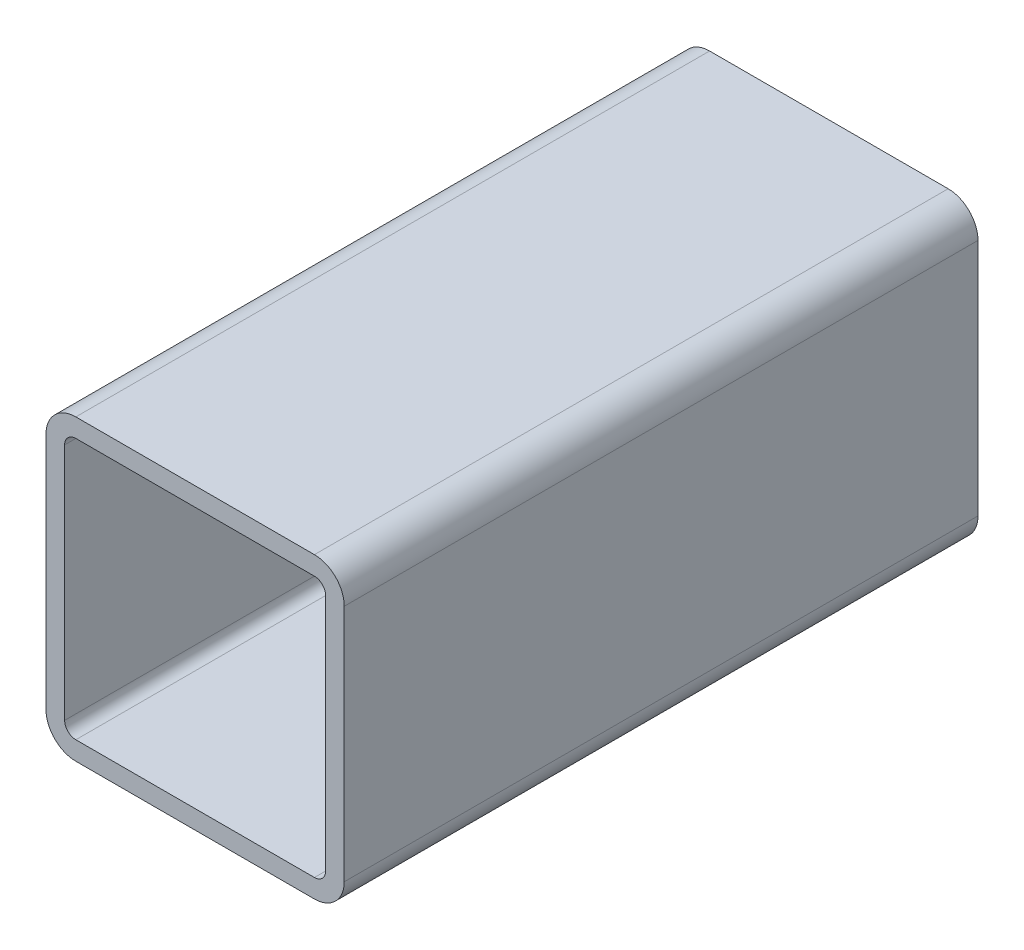
ISO-10303-21;
HEADER;
FILE_DESCRIPTION(('STEP AP214'),'2;1');
FILE_NAME('part.step','',(''),(''),'','','');
FILE_SCHEMA(('AUTOMOTIVE_DESIGN { 1 0 10303 214 1 1 1 1 }'));
ENDSEC;
DATA;
#1=APPLICATION_CONTEXT('core data for automotive mechanical design processes');
#2=APPLICATION_PROTOCOL_DEFINITION('international standard','automotive_design',2000,#1);
#3=PRODUCT_CONTEXT('',#1,'mechanical');
#4=PRODUCT('Part','Part','',(#3));
#5=PRODUCT_RELATED_PRODUCT_CATEGORY('part','',(#4));
#6=PRODUCT_DEFINITION_FORMATION('','',#4);
#7=PRODUCT_DEFINITION_CONTEXT('part definition',#1,'design');
#8=PRODUCT_DEFINITION('design','',#6,#7);
#9=PRODUCT_DEFINITION_SHAPE('','',#8);
#10=(LENGTH_UNIT() NAMED_UNIT(*) SI_UNIT(.MILLI.,.METRE.));
#11=(NAMED_UNIT(*) PLANE_ANGLE_UNIT() SI_UNIT($,.RADIAN.));
#12=(NAMED_UNIT(*) SI_UNIT($,.STERADIAN.) SOLID_ANGLE_UNIT());
#13=UNCERTAINTY_MEASURE_WITH_UNIT(LENGTH_MEASURE(1.E-05),#10,'distance_accuracy_value','');
#14=(GEOMETRIC_REPRESENTATION_CONTEXT(3) GLOBAL_UNCERTAINTY_ASSIGNED_CONTEXT((#13)) GLOBAL_UNIT_ASSIGNED_CONTEXT((#10,
#11,#12)) REPRESENTATION_CONTEXT('',''));
#15=CARTESIAN_POINT('',(0.,0.,0.));
#16=DIRECTION('',(0.,0.,1.));
#17=DIRECTION('',(1.,0.,0.));
#18=AXIS2_PLACEMENT_3D('',#15,#16,#17);
#19=CARTESIAN_POINT('',(-560.,7.99999999999944,283.137084989848));
#20=DIRECTION('',(1.,0.,0.));
#21=DIRECTION('',(0.,0.,-1.));
#22=AXIS2_PLACEMENT_3D('',#19,#20,#21);
#23=PLANE('',#22);
#24=DIRECTION('',(0.,-1.,0.));
#25=VECTOR('',#24,1.);
#26=CARTESIAN_POINT('',(-560.,7.99999999999947,170.));
#27=LINE('',#26,#25);
#28=CARTESIAN_POINT('',(-560.,71.9999999999995,170.));
#29=VERTEX_POINT('',#28);
#30=CARTESIAN_POINT('',(-560.,7.99999999999944,170.));
#31=VERTEX_POINT('',#30);
#32=EDGE_CURVE('E304',#29,#31,#27,.T.);
#33=ORIENTED_EDGE('',*,*,#32,.F.);
#34=DIRECTION('',(0.,0.,-1.));
#35=VECTOR('',#34,1.);
#36=CARTESIAN_POINT('',(-560.,71.9999999999995,283.137084989848));
#37=LINE('',#36,#35);
#38=CARTESIAN_POINT('',(-560.,71.9999999999995,0.));
#39=VERTEX_POINT('',#38);
#40=EDGE_CURVE('E48',#29,#39,#37,.T.);
#41=ORIENTED_EDGE('',*,*,#40,.T.);
#42=DIRECTION('',(0.,-1.,0.));
#43=VECTOR('',#42,1.);
#44=CARTESIAN_POINT('',(-560.,7.99999999999944,0.));
#45=LINE('',#44,#43);
#46=CARTESIAN_POINT('',(-560.,7.99999999999944,0.));
#47=VERTEX_POINT('',#46);
#48=EDGE_CURVE('E199',#39,#47,#45,.T.);
#49=ORIENTED_EDGE('',*,*,#48,.T.);
#50=DIRECTION('',(0.,0.,-1.));
#51=VECTOR('',#50,1.);
#52=CARTESIAN_POINT('',(-560.,7.99999999999944,283.137084989848));
#53=LINE('',#52,#51);
#54=EDGE_CURVE('E202',#31,#47,#53,.T.);
#55=ORIENTED_EDGE('',*,*,#54,.F.);
#56=EDGE_LOOP('',(#33,#41,#49,#55));
#57=FACE_BOUND('',#56,.T.);
#58=ADVANCED_FACE('F33',(#57),#23,.F.);
#59=CARTESIAN_POINT('',(-552.,71.9999999999995,283.137084989848));
#60=DIRECTION('',(0.,0.,-1.));
#61=DIRECTION('',(-1.,0.,0.));
#62=AXIS2_PLACEMENT_3D('',#59,#60,#61);
#63=CYLINDRICAL_SURFACE('',#62,8.);
#64=CARTESIAN_POINT('',(-552.,71.9999999999995,170.));
#65=DIRECTION('',(0.,0.,1.));
#66=DIRECTION('',(0.,-1.,0.));
#67=AXIS2_PLACEMENT_3D('',#64,#65,#66);
#68=CIRCLE('',#67,8.);
#69=CARTESIAN_POINT('',(-552.,79.9999999999995,170.));
#70=VERTEX_POINT('',#69);
#71=EDGE_CURVE('E240',#70,#29,#68,.T.);
#72=ORIENTED_EDGE('',*,*,#71,.F.);
#73=DIRECTION('',(0.,0.,-1.));
#74=VECTOR('',#73,1.);
#75=CARTESIAN_POINT('',(-552.,79.9999999999995,283.137084989848));
#76=LINE('',#75,#74);
#77=CARTESIAN_POINT('',(-552.,79.9999999999995,0.));
#78=VERTEX_POINT('',#77);
#79=EDGE_CURVE('E205',#70,#78,#76,.T.);
#80=ORIENTED_EDGE('',*,*,#79,.T.);
#81=CARTESIAN_POINT('',(-552.,71.9999999999995,0.));
#82=DIRECTION('',(0.,0.,1.));
#83=DIRECTION('',(-1.,0.,0.));
#84=AXIS2_PLACEMENT_3D('',#81,#82,#83);
#85=CIRCLE('',#84,8.);
#86=EDGE_CURVE('E197',#78,#39,#85,.T.);
#87=ORIENTED_EDGE('',*,*,#86,.T.);
#88=ORIENTED_EDGE('',*,*,#40,.F.);
#89=EDGE_LOOP('',(#72,#80,#87,#88));
#90=FACE_BOUND('',#89,.T.);
#91=ADVANCED_FACE('F237',(#90),#63,.T.);
#92=CARTESIAN_POINT('',(-488.,79.9999999999995,283.137084989848));
#93=DIRECTION('',(0.,-1.,0.));
#94=DIRECTION('',(0.,0.,-1.));
#95=AXIS2_PLACEMENT_3D('',#92,#93,#94);
#96=PLANE('',#95);
#97=DIRECTION('',(-1.,0.,0.));
#98=VECTOR('',#97,1.);
#99=CARTESIAN_POINT('',(-488.,79.9999999999995,170.));
#100=LINE('',#99,#98);
#101=CARTESIAN_POINT('',(-488.,79.9999999999995,170.));
#102=VERTEX_POINT('',#101);
#103=EDGE_CURVE('E245',#102,#70,#100,.T.);
#104=ORIENTED_EDGE('',*,*,#103,.F.);
#105=DIRECTION('',(0.,0.,-1.));
#106=VECTOR('',#105,1.);
#107=CARTESIAN_POINT('',(-488.,79.9999999999995,283.137084989848));
#108=LINE('',#107,#106);
#109=CARTESIAN_POINT('',(-488.,79.9999999999995,0.));
#110=VERTEX_POINT('',#109);
#111=EDGE_CURVE('E207',#102,#110,#108,.T.);
#112=ORIENTED_EDGE('',*,*,#111,.T.);
#113=DIRECTION('',(-1.,0.,0.));
#114=VECTOR('',#113,1.);
#115=CARTESIAN_POINT('',(-488.,79.9999999999995,0.));
#116=LINE('',#115,#114);
#117=EDGE_CURVE('E194',#110,#78,#116,.T.);
#118=ORIENTED_EDGE('',*,*,#117,.T.);
#119=ORIENTED_EDGE('',*,*,#79,.F.);
#120=EDGE_LOOP('',(#104,#112,#118,#119));
#121=FACE_BOUND('',#120,.T.);
#122=ADVANCED_FACE('F243',(#121),#96,.F.);
#123=CARTESIAN_POINT('',(-488.,71.9999999999995,283.137084989848));
#124=DIRECTION('',(0.,0.,-1.));
#125=DIRECTION('',(-1.,0.,0.));
#126=AXIS2_PLACEMENT_3D('',#123,#124,#125);
#127=CYLINDRICAL_SURFACE('',#126,7.99999999999999);
#128=CARTESIAN_POINT('',(-488.,71.9999999999995,170.));
#129=DIRECTION('',(0.,0.,1.));
#130=DIRECTION('',(0.,-1.,0.));
#131=AXIS2_PLACEMENT_3D('',#128,#129,#130);
#132=CIRCLE('',#131,7.99999999999999);
#133=CARTESIAN_POINT('',(-480.,71.9999999999995,170.));
#134=VERTEX_POINT('',#133);
#135=EDGE_CURVE('E308',#134,#102,#132,.T.);
#136=ORIENTED_EDGE('',*,*,#135,.F.);
#137=DIRECTION('',(0.,0.,-1.));
#138=VECTOR('',#137,1.);
#139=CARTESIAN_POINT('',(-480.,71.9999999999995,283.137084989848));
#140=LINE('',#139,#138);
#141=CARTESIAN_POINT('',(-480.,71.9999999999995,0.));
#142=VERTEX_POINT('',#141);
#143=EDGE_CURVE('E209',#134,#142,#140,.T.);
#144=ORIENTED_EDGE('',*,*,#143,.T.);
#145=CARTESIAN_POINT('',(-488.,71.9999999999995,0.));
#146=DIRECTION('',(0.,0.,1.));
#147=DIRECTION('',(-1.,0.,0.));
#148=AXIS2_PLACEMENT_3D('',#145,#146,#147);
#149=CIRCLE('',#148,7.99999999999999);
#150=EDGE_CURVE('E191',#142,#110,#149,.T.);
#151=ORIENTED_EDGE('',*,*,#150,.T.);
#152=ORIENTED_EDGE('',*,*,#111,.F.);
#153=EDGE_LOOP('',(#136,#144,#151,#152));
#154=FACE_BOUND('',#153,.T.);
#155=ADVANCED_FACE('F248',(#154),#127,.T.);
#156=CARTESIAN_POINT('',(-480.,7.99999999999946,283.137084989848));
#157=DIRECTION('',(-1.,0.,0.));
#158=DIRECTION('',(0.,0.,1.));
#159=AXIS2_PLACEMENT_3D('',#156,#157,#158);
#160=PLANE('',#159);
#161=DIRECTION('',(0.,1.,0.));
#162=VECTOR('',#161,1.);
#163=CARTESIAN_POINT('',(-480.,7.99999999999949,170.));
#164=LINE('',#163,#162);
#165=CARTESIAN_POINT('',(-480.,7.99999999999946,170.));
#166=VERTEX_POINT('',#165);
#167=EDGE_CURVE('E254',#166,#134,#164,.T.);
#168=ORIENTED_EDGE('',*,*,#167,.F.);
#169=DIRECTION('',(0.,0.,-1.));
#170=VECTOR('',#169,1.);
#171=CARTESIAN_POINT('',(-480.,7.99999999999946,283.137084989848));
#172=LINE('',#171,#170);
#173=CARTESIAN_POINT('',(-480.,7.99999999999946,0.));
#174=VERTEX_POINT('',#173);
#175=EDGE_CURVE('E211',#166,#174,#172,.T.);
#176=ORIENTED_EDGE('',*,*,#175,.T.);
#177=DIRECTION('',(0.,1.,0.));
#178=VECTOR('',#177,1.);
#179=CARTESIAN_POINT('',(-480.,7.99999999999946,0.));
#180=LINE('',#179,#178);
#181=EDGE_CURVE('E188',#174,#142,#180,.T.);
#182=ORIENTED_EDGE('',*,*,#181,.T.);
#183=ORIENTED_EDGE('',*,*,#143,.F.);
#184=EDGE_LOOP('',(#168,#176,#182,#183));
#185=FACE_BOUND('',#184,.T.);
#186=ADVANCED_FACE('F251',(#185),#160,.F.);
#187=CARTESIAN_POINT('',(-488.,7.99999999999946,283.137084989848));
#188=DIRECTION('',(0.,0.,-1.));
#189=DIRECTION('',(-1.,0.,0.));
#190=AXIS2_PLACEMENT_3D('',#187,#188,#189);
#191=CYLINDRICAL_SURFACE('',#190,8.00000000000001);
#192=CARTESIAN_POINT('',(-488.,7.99999999999946,170.));
#193=DIRECTION('',(0.,0.,1.));
#194=DIRECTION('',(0.,-1.,0.));
#195=AXIS2_PLACEMENT_3D('',#192,#193,#194);
#196=CIRCLE('',#195,8.00000000000001);
#197=CARTESIAN_POINT('',(-488.,-5.48172618408671E-13,170.));
#198=VERTEX_POINT('',#197);
#199=EDGE_CURVE('E258',#198,#166,#196,.T.);
#200=ORIENTED_EDGE('',*,*,#199,.F.);
#201=DIRECTION('',(0.,0.,-1.));
#202=VECTOR('',#201,1.);
#203=CARTESIAN_POINT('',(-488.,-5.48172618408671E-13,283.137084989848));
#204=LINE('',#203,#202);
#205=CARTESIAN_POINT('',(-488.,-5.48172618408671E-13,0.));
#206=VERTEX_POINT('',#205);
#207=EDGE_CURVE('E213',#198,#206,#204,.T.);
#208=ORIENTED_EDGE('',*,*,#207,.T.);
#209=CARTESIAN_POINT('',(-488.,7.99999999999946,0.));
#210=DIRECTION('',(0.,0.,1.));
#211=DIRECTION('',(-1.,0.,0.));
#212=AXIS2_PLACEMENT_3D('',#209,#210,#211);
#213=CIRCLE('',#212,8.00000000000001);
#214=EDGE_CURVE('E185',#206,#174,#213,.T.);
#215=ORIENTED_EDGE('',*,*,#214,.T.);
#216=ORIENTED_EDGE('',*,*,#175,.F.);
#217=EDGE_LOOP('',(#200,#208,#215,#216));
#218=FACE_BOUND('',#217,.T.);
#219=ADVANCED_FACE('F257',(#218),#191,.T.);
#220=CARTESIAN_POINT('',(-488.,-5.49907341884648E-13,283.137084989848));
#221=DIRECTION('',(0.,1.,0.));
#222=DIRECTION('',(-1.,0.,0.));
#223=AXIS2_PLACEMENT_3D('',#220,#221,#222);
#224=PLANE('',#223);
#225=DIRECTION('',(1.,0.,0.));
#226=VECTOR('',#225,1.);
#227=CARTESIAN_POINT('',(-488.,-5.49907341884648E-13,170.));
#228=LINE('',#227,#226);
#229=CARTESIAN_POINT('',(-552.,-5.58580959264532E-13,170.));
#230=VERTEX_POINT('',#229);
#231=EDGE_CURVE('E221',#230,#198,#228,.T.);
#232=ORIENTED_EDGE('',*,*,#231,.F.);
#233=DIRECTION('',(0.,0.,-1.));
#234=VECTOR('',#233,1.);
#235=CARTESIAN_POINT('',(-552.,-5.58580959264532E-13,283.137084989848));
#236=LINE('',#235,#234);
#237=CARTESIAN_POINT('',(-552.,-5.58580959264532E-13,0.));
#238=VERTEX_POINT('',#237);
#239=EDGE_CURVE('E41',#230,#238,#236,.T.);
#240=ORIENTED_EDGE('',*,*,#239,.T.);
#241=DIRECTION('',(1.,0.,0.));
#242=VECTOR('',#241,1.);
#243=CARTESIAN_POINT('',(-488.,-5.49907341884648E-13,0.));
#244=LINE('',#243,#242);
#245=EDGE_CURVE('E182',#238,#206,#244,.T.);
#246=ORIENTED_EDGE('',*,*,#245,.T.);
#247=ORIENTED_EDGE('',*,*,#207,.F.);
#248=EDGE_LOOP('',(#232,#240,#246,#247));
#249=FACE_BOUND('',#248,.T.);
#250=ADVANCED_FACE('F217',(#249),#224,.F.);
#251=CARTESIAN_POINT('',(-552.,7.99999999999944,283.137084989848));
#252=DIRECTION('',(0.,0.,-1.));
#253=DIRECTION('',(-1.,0.,0.));
#254=AXIS2_PLACEMENT_3D('',#251,#252,#253);
#255=CYLINDRICAL_SURFACE('',#254,8.);
#256=CARTESIAN_POINT('',(-552.,7.99999999999944,170.));
#257=DIRECTION('',(0.,0.,1.));
#258=DIRECTION('',(0.,-1.,0.));
#259=AXIS2_PLACEMENT_3D('',#256,#257,#258);
#260=CIRCLE('',#259,8.);
#261=EDGE_CURVE('E231',#31,#230,#260,.T.);
#262=ORIENTED_EDGE('',*,*,#261,.F.);
#263=ORIENTED_EDGE('',*,*,#54,.T.);
#264=CARTESIAN_POINT('',(-552.,7.99999999999944,0.));
#265=DIRECTION('',(0.,0.,1.));
#266=DIRECTION('',(1.,0.,0.));
#267=AXIS2_PLACEMENT_3D('',#264,#265,#266);
#268=CIRCLE('',#267,8.);
#269=EDGE_CURVE('E179',#47,#238,#268,.T.);
#270=ORIENTED_EDGE('',*,*,#269,.T.);
#271=ORIENTED_EDGE('',*,*,#239,.F.);
#272=EDGE_LOOP('',(#262,#263,#270,#271));
#273=FACE_BOUND('',#272,.T.);
#274=ADVANCED_FACE('F35',(#273),#255,.T.);
#275=CARTESIAN_POINT('',(-552.,7.99999999999944,0.));
#276=DIRECTION('',(0.,0.,1.));
#277=DIRECTION('',(1.,0.,0.));
#278=AXIS2_PLACEMENT_3D('',#275,#276,#277);
#279=PLANE('',#278);
#280=ORIENTED_EDGE('',*,*,#269,.F.);
#281=ORIENTED_EDGE('',*,*,#48,.F.);
#282=ORIENTED_EDGE('',*,*,#86,.F.);
#283=ORIENTED_EDGE('',*,*,#117,.F.);
#284=ORIENTED_EDGE('',*,*,#150,.F.);
#285=ORIENTED_EDGE('',*,*,#181,.F.);
#286=ORIENTED_EDGE('',*,*,#214,.F.);
#287=ORIENTED_EDGE('',*,*,#245,.F.);
#288=EDGE_LOOP('',(#280,#281,#282,#283,#284,#285,#286,#287));
#289=FACE_BOUND('',#288,.T.);
#290=CARTESIAN_POINT('',(-488.,7.99999999999946,0.));
#291=DIRECTION('',(0.,0.,1.));
#292=DIRECTION('',(-1.,0.,0.));
#293=AXIS2_PLACEMENT_3D('',#290,#291,#292);
#294=CIRCLE('',#293,3.00000000000001);
#295=CARTESIAN_POINT('',(-488.,4.99999999999945,0.));
#296=VERTEX_POINT('',#295);
#297=CARTESIAN_POINT('',(-485.,7.99999999999946,0.));
#298=VERTEX_POINT('',#297);
#299=EDGE_CURVE('E260',#296,#298,#294,.T.);
#300=ORIENTED_EDGE('',*,*,#299,.T.);
#301=DIRECTION('',(0.,1.,0.));
#302=VECTOR('',#301,1.);
#303=CARTESIAN_POINT('',(-485.,7.99999999999946,0.));
#304=LINE('',#303,#302);
#305=CARTESIAN_POINT('',(-485.,71.9999999999995,0.));
#306=VERTEX_POINT('',#305);
#307=EDGE_CURVE('E267',#298,#306,#304,.T.);
#308=ORIENTED_EDGE('',*,*,#307,.T.);
#309=CARTESIAN_POINT('',(-488.,71.9999999999995,0.));
#310=DIRECTION('',(0.,0.,1.));
#311=DIRECTION('',(-1.,0.,0.));
#312=AXIS2_PLACEMENT_3D('',#309,#310,#311);
#313=CIRCLE('',#312,2.99999999999999);
#314=CARTESIAN_POINT('',(-488.,74.9999999999995,0.));
#315=VERTEX_POINT('',#314);
#316=EDGE_CURVE('E270',#306,#315,#313,.T.);
#317=ORIENTED_EDGE('',*,*,#316,.T.);
#318=DIRECTION('',(-1.,0.,0.));
#319=VECTOR('',#318,1.);
#320=CARTESIAN_POINT('',(-488.,74.9999999999995,0.));
#321=LINE('',#320,#319);
#322=CARTESIAN_POINT('',(-552.,74.9999999999995,0.));
#323=VERTEX_POINT('',#322);
#324=EDGE_CURVE('E273',#315,#323,#321,.T.);
#325=ORIENTED_EDGE('',*,*,#324,.T.);
#326=CARTESIAN_POINT('',(-552.,71.9999999999995,0.));
#327=DIRECTION('',(0.,0.,1.));
#328=DIRECTION('',(-1.,0.,0.));
#329=AXIS2_PLACEMENT_3D('',#326,#327,#328);
#330=CIRCLE('',#329,3.);
#331=CARTESIAN_POINT('',(-555.,71.9999999999995,0.));
#332=VERTEX_POINT('',#331);
#333=EDGE_CURVE('E276',#323,#332,#330,.T.);
#334=ORIENTED_EDGE('',*,*,#333,.T.);
#335=DIRECTION('',(0.,-1.,0.));
#336=VECTOR('',#335,1.);
#337=CARTESIAN_POINT('',(-555.,7.99999999999944,0.));
#338=LINE('',#337,#336);
#339=CARTESIAN_POINT('',(-555.,7.99999999999944,0.));
#340=VERTEX_POINT('',#339);
#341=EDGE_CURVE('E279',#332,#340,#338,.T.);
#342=ORIENTED_EDGE('',*,*,#341,.T.);
#343=CARTESIAN_POINT('',(-552.,7.99999999999944,0.));
#344=DIRECTION('',(0.,0.,1.));
#345=DIRECTION('',(1.,0.,0.));
#346=AXIS2_PLACEMENT_3D('',#343,#344,#345);
#347=CIRCLE('',#346,3.);
#348=CARTESIAN_POINT('',(-552.,4.99999999999944,0.));
#349=VERTEX_POINT('',#348);
#350=EDGE_CURVE('E282',#340,#349,#347,.T.);
#351=ORIENTED_EDGE('',*,*,#350,.T.);
#352=DIRECTION('',(1.,0.,0.));
#353=VECTOR('',#352,1.);
#354=CARTESIAN_POINT('',(-488.,4.99999999999945,0.));
#355=LINE('',#354,#353);
#356=EDGE_CURVE('E161',#349,#296,#355,.T.);
#357=ORIENTED_EDGE('',*,*,#356,.T.);
#358=EDGE_LOOP('',(#300,#308,#317,#325,#334,#342,#351,#357));
#359=FACE_BOUND('',#358,.T.);
#360=ADVANCED_FACE('F227',(#289,#359),#279,.F.);
#361=CARTESIAN_POINT('',(-488.,4.99999999999945,283.137084989848));
#362=DIRECTION('',(0.,1.,0.));
#363=DIRECTION('',(-1.,0.,0.));
#364=AXIS2_PLACEMENT_3D('',#361,#362,#363);
#365=PLANE('',#364);
#366=DIRECTION('',(0.,0.,-1.));
#367=VECTOR('',#366,1.);
#368=CARTESIAN_POINT('',(-552.,4.99999999999944,283.137084989848));
#369=LINE('',#368,#367);
#370=CARTESIAN_POINT('',(-552.,4.99999999999944,170.));
#371=VERTEX_POINT('',#370);
#372=EDGE_CURVE('E153',#371,#349,#369,.T.);
#373=ORIENTED_EDGE('',*,*,#372,.F.);
#374=DIRECTION('',(1.,0.,0.));
#375=VECTOR('',#374,1.);
#376=CARTESIAN_POINT('',(-488.,4.99999999999945,170.));
#377=LINE('',#376,#375);
#378=CARTESIAN_POINT('',(-488.,4.99999999999945,170.));
#379=VERTEX_POINT('',#378);
#380=EDGE_CURVE('E11',#371,#379,#377,.T.);
#381=ORIENTED_EDGE('',*,*,#380,.T.);
#382=DIRECTION('',(0.,0.,-1.));
#383=VECTOR('',#382,1.);
#384=CARTESIAN_POINT('',(-488.,4.99999999999945,283.137084989848));
#385=LINE('',#384,#383);
#386=EDGE_CURVE('E163',#379,#296,#385,.T.);
#387=ORIENTED_EDGE('',*,*,#386,.T.);
#388=ORIENTED_EDGE('',*,*,#356,.F.);
#389=EDGE_LOOP('',(#373,#381,#387,#388));
#390=FACE_BOUND('',#389,.T.);
#391=ADVANCED_FACE('F159',(#390),#365,.T.);
#392=CARTESIAN_POINT('',(-552.,7.99999999999944,283.137084989848));
#393=DIRECTION('',(0.,0.,-1.));
#394=DIRECTION('',(-1.,0.,0.));
#395=AXIS2_PLACEMENT_3D('',#392,#393,#394);
#396=CYLINDRICAL_SURFACE('',#395,3.);
#397=DIRECTION('',(0.,0.,-1.));
#398=VECTOR('',#397,1.);
#399=CARTESIAN_POINT('',(-555.,7.99999999999944,283.137084989848));
#400=LINE('',#399,#398);
#401=CARTESIAN_POINT('',(-555.,7.99999999999944,170.));
#402=VERTEX_POINT('',#401);
#403=EDGE_CURVE('E155',#402,#340,#400,.T.);
#404=ORIENTED_EDGE('',*,*,#403,.F.);
#405=CARTESIAN_POINT('',(-552.,7.99999999999944,170.));
#406=DIRECTION('',(0.,0.,1.));
#407=DIRECTION('',(0.,-1.,0.));
#408=AXIS2_PLACEMENT_3D('',#405,#406,#407);
#409=CIRCLE('',#408,3.);
#410=EDGE_CURVE('E146',#402,#371,#409,.T.);
#411=ORIENTED_EDGE('',*,*,#410,.T.);
#412=ORIENTED_EDGE('',*,*,#372,.T.);
#413=ORIENTED_EDGE('',*,*,#350,.F.);
#414=EDGE_LOOP('',(#404,#411,#412,#413));
#415=FACE_BOUND('',#414,.T.);
#416=ADVANCED_FACE('F151',(#415),#396,.F.);
#417=CARTESIAN_POINT('',(-555.,7.99999999999944,283.137084989848));
#418=DIRECTION('',(1.,0.,0.));
#419=DIRECTION('',(0.,0.,-1.));
#420=AXIS2_PLACEMENT_3D('',#417,#418,#419);
#421=PLANE('',#420);
#422=DIRECTION('',(0.,0.,-1.));
#423=VECTOR('',#422,1.);
#424=CARTESIAN_POINT('',(-555.,71.9999999999995,283.137084989848));
#425=LINE('',#424,#423);
#426=CARTESIAN_POINT('',(-555.,71.9999999999995,170.));
#427=VERTEX_POINT('',#426);
#428=EDGE_CURVE('E165',#427,#332,#425,.T.);
#429=ORIENTED_EDGE('',*,*,#428,.F.);
#430=DIRECTION('',(0.,-1.,0.));
#431=VECTOR('',#430,1.);
#432=CARTESIAN_POINT('',(-555.,7.99999999999947,170.));
#433=LINE('',#432,#431);
#434=EDGE_CURVE('E157',#427,#402,#433,.T.);
#435=ORIENTED_EDGE('',*,*,#434,.T.);
#436=ORIENTED_EDGE('',*,*,#403,.T.);
#437=ORIENTED_EDGE('',*,*,#341,.F.);
#438=EDGE_LOOP('',(#429,#435,#436,#437));
#439=FACE_BOUND('',#438,.T.);
#440=ADVANCED_FACE('F288',(#439),#421,.T.);
#441=CARTESIAN_POINT('',(-552.,71.9999999999995,283.137084989848));
#442=DIRECTION('',(0.,0.,-1.));
#443=DIRECTION('',(-1.,0.,0.));
#444=AXIS2_PLACEMENT_3D('',#441,#442,#443);
#445=CYLINDRICAL_SURFACE('',#444,3.);
#446=DIRECTION('',(0.,0.,-1.));
#447=VECTOR('',#446,1.);
#448=CARTESIAN_POINT('',(-552.,74.9999999999995,283.137084989848));
#449=LINE('',#448,#447);
#450=CARTESIAN_POINT('',(-552.,74.9999999999995,170.));
#451=VERTEX_POINT('',#450);
#452=EDGE_CURVE('E171',#451,#323,#449,.T.);
#453=ORIENTED_EDGE('',*,*,#452,.F.);
#454=CARTESIAN_POINT('',(-552.,71.9999999999995,170.));
#455=DIRECTION('',(0.,0.,1.));
#456=DIRECTION('',(0.,-1.,0.));
#457=AXIS2_PLACEMENT_3D('',#454,#455,#456);
#458=CIRCLE('',#457,3.);
#459=EDGE_CURVE('E290',#451,#427,#458,.T.);
#460=ORIENTED_EDGE('',*,*,#459,.T.);
#461=ORIENTED_EDGE('',*,*,#428,.T.);
#462=ORIENTED_EDGE('',*,*,#333,.F.);
#463=EDGE_LOOP('',(#453,#460,#461,#462));
#464=FACE_BOUND('',#463,.T.);
#465=ADVANCED_FACE('F325',(#464),#445,.F.);
#466=CARTESIAN_POINT('',(-488.,74.9999999999995,283.137084989848));
#467=DIRECTION('',(0.,-1.,0.));
#468=DIRECTION('',(1.,0.,0.));
#469=AXIS2_PLACEMENT_3D('',#466,#467,#468);
#470=PLANE('',#469);
#471=DIRECTION('',(0.,0.,-1.));
#472=VECTOR('',#471,1.);
#473=CARTESIAN_POINT('',(-488.,74.9999999999995,283.137084989848));
#474=LINE('',#473,#472);
#475=CARTESIAN_POINT('',(-488.,74.9999999999995,170.));
#476=VERTEX_POINT('',#475);
#477=EDGE_CURVE('E173',#476,#315,#474,.T.);
#478=ORIENTED_EDGE('',*,*,#477,.F.);
#479=DIRECTION('',(-1.,0.,0.));
#480=VECTOR('',#479,1.);
#481=CARTESIAN_POINT('',(-488.,74.9999999999995,170.));
#482=LINE('',#481,#480);
#483=EDGE_CURVE('E292',#476,#451,#482,.T.);
#484=ORIENTED_EDGE('',*,*,#483,.T.);
#485=ORIENTED_EDGE('',*,*,#452,.T.);
#486=ORIENTED_EDGE('',*,*,#324,.F.);
#487=EDGE_LOOP('',(#478,#484,#485,#486));
#488=FACE_BOUND('',#487,.T.);
#489=ADVANCED_FACE('F322',(#488),#470,.T.);
#490=CARTESIAN_POINT('',(-488.,71.9999999999995,283.137084989848));
#491=DIRECTION('',(0.,0.,-1.));
#492=DIRECTION('',(-1.,0.,0.));
#493=AXIS2_PLACEMENT_3D('',#490,#491,#492);
#494=CYLINDRICAL_SURFACE('',#493,2.99999999999999);
#495=DIRECTION('',(0.,0.,-1.));
#496=VECTOR('',#495,1.);
#497=CARTESIAN_POINT('',(-485.,71.9999999999995,283.137084989848));
#498=LINE('',#497,#496);
#499=CARTESIAN_POINT('',(-485.,71.9999999999995,170.));
#500=VERTEX_POINT('',#499);
#501=EDGE_CURVE('E175',#500,#306,#498,.T.);
#502=ORIENTED_EDGE('',*,*,#501,.F.);
#503=CARTESIAN_POINT('',(-488.,71.9999999999995,170.));
#504=DIRECTION('',(0.,0.,1.));
#505=DIRECTION('',(0.,-1.,0.));
#506=AXIS2_PLACEMENT_3D('',#503,#504,#505);
#507=CIRCLE('',#506,2.99999999999999);
#508=EDGE_CURVE('E297',#500,#476,#507,.T.);
#509=ORIENTED_EDGE('',*,*,#508,.T.);
#510=ORIENTED_EDGE('',*,*,#477,.T.);
#511=ORIENTED_EDGE('',*,*,#316,.F.);
#512=EDGE_LOOP('',(#502,#509,#510,#511));
#513=FACE_BOUND('',#512,.T.);
#514=ADVANCED_FACE('F319',(#513),#494,.F.);
#515=CARTESIAN_POINT('',(-485.,7.99999999999946,283.137084989848));
#516=DIRECTION('',(-1.,0.,0.));
#517=DIRECTION('',(0.,0.,1.));
#518=AXIS2_PLACEMENT_3D('',#515,#516,#517);
#519=PLANE('',#518);
#520=DIRECTION('',(0.,0.,-1.));
#521=VECTOR('',#520,1.);
#522=CARTESIAN_POINT('',(-485.,7.99999999999946,283.137084989848));
#523=LINE('',#522,#521);
#524=CARTESIAN_POINT('',(-485.,7.99999999999946,170.));
#525=VERTEX_POINT('',#524);
#526=EDGE_CURVE('E177',#525,#298,#523,.T.);
#527=ORIENTED_EDGE('',*,*,#526,.F.);
#528=DIRECTION('',(0.,1.,0.));
#529=VECTOR('',#528,1.);
#530=CARTESIAN_POINT('',(-485.,7.99999999999949,170.));
#531=LINE('',#530,#529);
#532=EDGE_CURVE('E300',#525,#500,#531,.T.);
#533=ORIENTED_EDGE('',*,*,#532,.T.);
#534=ORIENTED_EDGE('',*,*,#501,.T.);
#535=ORIENTED_EDGE('',*,*,#307,.F.);
#536=EDGE_LOOP('',(#527,#533,#534,#535));
#537=FACE_BOUND('',#536,.T.);
#538=ADVANCED_FACE('F314',(#537),#519,.T.);
#539=CARTESIAN_POINT('',(-488.,7.99999999999946,283.137084989848));
#540=DIRECTION('',(0.,0.,-1.));
#541=DIRECTION('',(-1.,0.,0.));
#542=AXIS2_PLACEMENT_3D('',#539,#540,#541);
#543=CYLINDRICAL_SURFACE('',#542,3.00000000000001);
#544=ORIENTED_EDGE('',*,*,#386,.F.);
#545=CARTESIAN_POINT('',(-488.,7.99999999999946,170.));
#546=DIRECTION('',(0.,0.,1.));
#547=DIRECTION('',(0.,-1.,0.));
#548=AXIS2_PLACEMENT_3D('',#545,#546,#547);
#549=CIRCLE('',#548,3.00000000000001);
#550=EDGE_CURVE('E56',#379,#525,#549,.T.);
#551=ORIENTED_EDGE('',*,*,#550,.T.);
#552=ORIENTED_EDGE('',*,*,#526,.T.);
#553=ORIENTED_EDGE('',*,*,#299,.F.);
#554=EDGE_LOOP('',(#544,#551,#552,#553));
#555=FACE_BOUND('',#554,.T.);
#556=ADVANCED_FACE('F310',(#555),#543,.F.);
#557=CARTESIAN_POINT('',(113.137084989848,7.99999999999983,170.));
#558=DIRECTION('',(0.,0.,1.));
#559=DIRECTION('',(1.,0.,0.));
#560=AXIS2_PLACEMENT_3D('',#557,#558,#559);
#561=PLANE('',#560);
#562=ORIENTED_EDGE('',*,*,#550,.F.);
#563=ORIENTED_EDGE('',*,*,#380,.F.);
#564=ORIENTED_EDGE('',*,*,#410,.F.);
#565=ORIENTED_EDGE('',*,*,#434,.F.);
#566=ORIENTED_EDGE('',*,*,#459,.F.);
#567=ORIENTED_EDGE('',*,*,#483,.F.);
#568=ORIENTED_EDGE('',*,*,#508,.F.);
#569=ORIENTED_EDGE('',*,*,#532,.F.);
#570=EDGE_LOOP('',(#562,#563,#564,#565,#566,#567,#568,#569));
#571=FACE_BOUND('',#570,.T.);
#572=ORIENTED_EDGE('',*,*,#32,.T.);
#573=ORIENTED_EDGE('',*,*,#261,.T.);
#574=ORIENTED_EDGE('',*,*,#231,.T.);
#575=ORIENTED_EDGE('',*,*,#199,.T.);
#576=ORIENTED_EDGE('',*,*,#167,.T.);
#577=ORIENTED_EDGE('',*,*,#135,.T.);
#578=ORIENTED_EDGE('',*,*,#103,.T.);
#579=ORIENTED_EDGE('',*,*,#71,.T.);
#580=EDGE_LOOP('',(#572,#573,#574,#575,#576,#577,#578,#579));
#581=FACE_BOUND('',#580,.T.);
#582=ADVANCED_FACE('F144',(#571,#581),#561,.T.);
#583=CLOSED_SHELL('',(#58,#91,#122,#155,#186,#219,#250,#274,#360,#391,#416,#440,#465,#489,#514,
#538,#556,#582));
#584=MANIFOLD_SOLID_BREP('B2',#583);
#585=ADVANCED_BREP_SHAPE_REPRESENTATION('',(#18,#584),#14);
#586=SHAPE_DEFINITION_REPRESENTATION(#9,#585);
ENDSEC;
END-ISO-10303-21;
